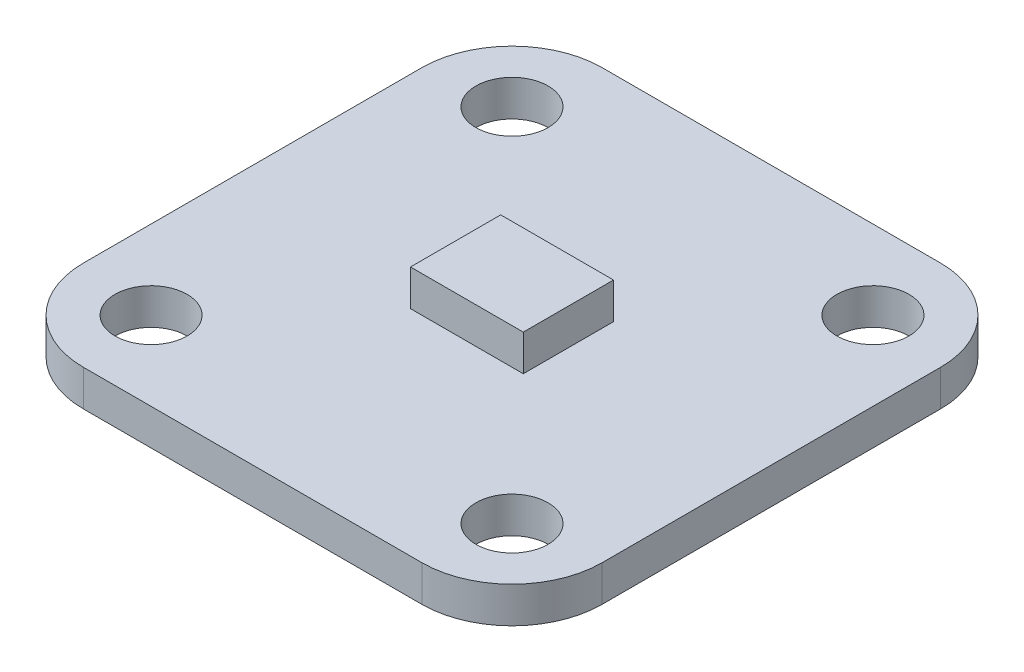
ISO-10303-21;
HEADER;
FILE_DESCRIPTION(('STEP AP214'),'2;1');
FILE_NAME('part.step','',(''),(''),'','','');
FILE_SCHEMA(('AUTOMOTIVE_DESIGN { 1 0 10303 214 1 1 1 1 }'));
ENDSEC;
DATA;
#1=APPLICATION_CONTEXT('core data for automotive mechanical design processes');
#2=APPLICATION_PROTOCOL_DEFINITION('international standard','automotive_design',2000,#1);
#3=PRODUCT_CONTEXT('',#1,'mechanical');
#4=PRODUCT('Part','Part','',(#3));
#5=PRODUCT_RELATED_PRODUCT_CATEGORY('part','',(#4));
#6=PRODUCT_DEFINITION_FORMATION('','',#4);
#7=PRODUCT_DEFINITION_CONTEXT('part definition',#1,'design');
#8=PRODUCT_DEFINITION('design','',#6,#7);
#9=PRODUCT_DEFINITION_SHAPE('','',#8);
#10=(LENGTH_UNIT() NAMED_UNIT(*) SI_UNIT(.MILLI.,.METRE.));
#11=(NAMED_UNIT(*) PLANE_ANGLE_UNIT() SI_UNIT($,.RADIAN.));
#12=(NAMED_UNIT(*) SI_UNIT($,.STERADIAN.) SOLID_ANGLE_UNIT());
#13=UNCERTAINTY_MEASURE_WITH_UNIT(LENGTH_MEASURE(1.E-05),#10,'distance_accuracy_value','');
#14=(GEOMETRIC_REPRESENTATION_CONTEXT(3) GLOBAL_UNCERTAINTY_ASSIGNED_CONTEXT((#13)) GLOBAL_UNIT_ASSIGNED_CONTEXT((#10,
#11,#12)) REPRESENTATION_CONTEXT('',''));
#15=CARTESIAN_POINT('',(0.,0.,0.));
#16=DIRECTION('',(0.,0.,1.));
#17=DIRECTION('',(1.,0.,0.));
#18=AXIS2_PLACEMENT_3D('',#15,#16,#17);
#19=CARTESIAN_POINT('',(0.,1.6,0.));
#20=DIRECTION('',(0.,-1.,0.));
#21=DIRECTION('',(0.,0.,-1.));
#22=AXIS2_PLACEMENT_3D('',#19,#20,#21);
#23=PLANE('',#22);
#24=CARTESIAN_POINT('',(-8.,1.6,-8.));
#25=DIRECTION('',(0.,-1.,0.));
#26=DIRECTION('',(0.,0.,-1.));
#27=AXIS2_PLACEMENT_3D('',#24,#25,#26);
#28=CIRCLE('',#27,1.60000000000011);
#29=CARTESIAN_POINT('',(-8.,1.6,-9.60000000000011));
#30=VERTEX_POINT('',#29);
#31=EDGE_CURVE('E477',#30,#30,#28,.F.);
#32=ORIENTED_EDGE('',*,*,#31,.F.);
#33=EDGE_LOOP('',(#32));
#34=FACE_BOUND('',#33,.T.);
#35=CARTESIAN_POINT('',(8.,1.6,-8.));
#36=DIRECTION('',(0.,-1.,0.));
#37=DIRECTION('',(0.,0.,-1.));
#38=AXIS2_PLACEMENT_3D('',#35,#36,#37);
#39=CIRCLE('',#38,1.60000000000007);
#40=CARTESIAN_POINT('',(8.,1.6,-9.60000000000007));
#41=VERTEX_POINT('',#40);
#42=EDGE_CURVE('E476',#41,#41,#39,.F.);
#43=ORIENTED_EDGE('',*,*,#42,.F.);
#44=EDGE_LOOP('',(#43));
#45=FACE_BOUND('',#44,.T.);
#46=CARTESIAN_POINT('',(8.,1.6,8.));
#47=DIRECTION('',(0.,-1.,0.));
#48=DIRECTION('',(0.,0.,-1.));
#49=AXIS2_PLACEMENT_3D('',#46,#47,#48);
#50=CIRCLE('',#49,1.60000000000004);
#51=CARTESIAN_POINT('',(8.,1.6,6.39999999999996));
#52=VERTEX_POINT('',#51);
#53=EDGE_CURVE('E483',#52,#52,#50,.F.);
#54=ORIENTED_EDGE('',*,*,#53,.F.);
#55=EDGE_LOOP('',(#54));
#56=FACE_BOUND('',#55,.T.);
#57=CARTESIAN_POINT('',(-8.,1.6,8.));
#58=DIRECTION('',(0.,-1.,0.));
#59=DIRECTION('',(0.,0.,-1.));
#60=AXIS2_PLACEMENT_3D('',#57,#58,#59);
#61=CIRCLE('',#60,1.6);
#62=CARTESIAN_POINT('',(-8.,1.6,6.4));
#63=VERTEX_POINT('',#62);
#64=EDGE_CURVE('E464',#63,#63,#61,.F.);
#65=ORIENTED_EDGE('',*,*,#64,.F.);
#66=EDGE_LOOP('',(#65));
#67=FACE_BOUND('',#66,.T.);
#68=DIRECTION('',(0.,0.,-1.));
#69=VECTOR('',#68,1.);
#70=CARTESIAN_POINT('',(11.5,1.6,11.5));
#71=LINE('',#70,#69);
#72=CARTESIAN_POINT('',(11.5,1.6,7.5));
#73=VERTEX_POINT('',#72);
#74=CARTESIAN_POINT('',(11.5,1.6,-7.5));
#75=VERTEX_POINT('',#74);
#76=EDGE_CURVE('E166',#73,#75,#71,.T.);
#77=ORIENTED_EDGE('',*,*,#76,.T.);
#78=CARTESIAN_POINT('',(7.5,1.6,-7.5));
#79=DIRECTION('',(0.,-1.,0.));
#80=DIRECTION('',(0.,0.,-1.));
#81=AXIS2_PLACEMENT_3D('',#78,#79,#80);
#82=CIRCLE('',#81,4.);
#83=CARTESIAN_POINT('',(7.5,1.6,-11.5));
#84=VERTEX_POINT('',#83);
#85=EDGE_CURVE('E206',#75,#84,#82,.F.);
#86=ORIENTED_EDGE('',*,*,#85,.T.);
#87=DIRECTION('',(-1.,0.,0.));
#88=VECTOR('',#87,1.);
#89=CARTESIAN_POINT('',(-11.5,1.6,-11.5));
#90=LINE('',#89,#88);
#91=CARTESIAN_POINT('',(-7.5,1.6,-11.5));
#92=VERTEX_POINT('',#91);
#93=EDGE_CURVE('E169',#84,#92,#90,.T.);
#94=ORIENTED_EDGE('',*,*,#93,.T.);
#95=CARTESIAN_POINT('',(-7.5,1.6,-7.5));
#96=DIRECTION('',(0.,-1.,0.));
#97=DIRECTION('',(0.,0.,-1.));
#98=AXIS2_PLACEMENT_3D('',#95,#96,#97);
#99=CIRCLE('',#98,4.);
#100=CARTESIAN_POINT('',(-11.5,1.6,-7.5));
#101=VERTEX_POINT('',#100);
#102=EDGE_CURVE('E204',#92,#101,#99,.F.);
#103=ORIENTED_EDGE('',*,*,#102,.T.);
#104=DIRECTION('',(0.,0.,1.));
#105=VECTOR('',#104,1.);
#106=CARTESIAN_POINT('',(-11.5,1.6,11.5));
#107=LINE('',#106,#105);
#108=CARTESIAN_POINT('',(-11.5,1.6,7.5));
#109=VERTEX_POINT('',#108);
#110=EDGE_CURVE('E173',#101,#109,#107,.T.);
#111=ORIENTED_EDGE('',*,*,#110,.T.);
#112=CARTESIAN_POINT('',(-7.5,1.6,7.5));
#113=DIRECTION('',(0.,-1.,0.));
#114=DIRECTION('',(0.,0.,-1.));
#115=AXIS2_PLACEMENT_3D('',#112,#113,#114);
#116=CIRCLE('',#115,4.);
#117=CARTESIAN_POINT('',(-7.5,1.6,11.5));
#118=VERTEX_POINT('',#117);
#119=EDGE_CURVE('E63',#109,#118,#116,.F.);
#120=ORIENTED_EDGE('',*,*,#119,.T.);
#121=DIRECTION('',(1.,0.,0.));
#122=VECTOR('',#121,1.);
#123=CARTESIAN_POINT('',(-11.5,1.6,11.5));
#124=LINE('',#123,#122);
#125=CARTESIAN_POINT('',(7.5,1.6,11.5));
#126=VERTEX_POINT('',#125);
#127=EDGE_CURVE('E175',#118,#126,#124,.T.);
#128=ORIENTED_EDGE('',*,*,#127,.T.);
#129=CARTESIAN_POINT('',(7.5,1.6,7.5));
#130=DIRECTION('',(0.,-1.,0.));
#131=DIRECTION('',(0.,0.,-1.));
#132=AXIS2_PLACEMENT_3D('',#129,#130,#131);
#133=CIRCLE('',#132,4.);
#134=EDGE_CURVE('E202',#126,#73,#133,.F.);
#135=ORIENTED_EDGE('',*,*,#134,.T.);
#136=EDGE_LOOP('',(#77,#86,#94,#103,#111,#120,#128,#135));
#137=FACE_BOUND('',#136,.T.);
#138=DIRECTION('',(0.,0.,-1.));
#139=VECTOR('',#138,1.);
#140=CARTESIAN_POINT('',(2.5,1.6,2.));
#141=LINE('',#140,#139);
#142=CARTESIAN_POINT('',(2.5,1.6,2.));
#143=VERTEX_POINT('',#142);
#144=CARTESIAN_POINT('',(2.5,1.6,-2.));
#145=VERTEX_POINT('',#144);
#146=EDGE_CURVE('E156',#143,#145,#141,.T.);
#147=ORIENTED_EDGE('',*,*,#146,.F.);
#148=DIRECTION('',(1.,0.,0.));
#149=VECTOR('',#148,1.);
#150=CARTESIAN_POINT('',(-2.5,1.6,2.));
#151=LINE('',#150,#149);
#152=CARTESIAN_POINT('',(-2.5,1.6,2.));
#153=VERTEX_POINT('',#152);
#154=EDGE_CURVE('E153',#153,#143,#151,.T.);
#155=ORIENTED_EDGE('',*,*,#154,.F.);
#156=DIRECTION('',(0.,0.,1.));
#157=VECTOR('',#156,1.);
#158=CARTESIAN_POINT('',(-2.5,1.6,2.));
#159=LINE('',#158,#157);
#160=CARTESIAN_POINT('',(-2.5,1.6,-2.));
#161=VERTEX_POINT('',#160);
#162=EDGE_CURVE('E453',#161,#153,#159,.T.);
#163=ORIENTED_EDGE('',*,*,#162,.F.);
#164=DIRECTION('',(-1.,0.,0.));
#165=VECTOR('',#164,1.);
#166=CARTESIAN_POINT('',(-2.5,1.6,-2.));
#167=LINE('',#166,#165);
#168=EDGE_CURVE('E455',#145,#161,#167,.T.);
#169=ORIENTED_EDGE('',*,*,#168,.F.);
#170=EDGE_LOOP('',(#147,#155,#163,#169));
#171=FACE_BOUND('',#170,.T.);
#172=ADVANCED_FACE('F43',(#34,#45,#56,#67,#137,#171),#23,.F.);
#173=CARTESIAN_POINT('',(11.5,1.6,11.5));
#174=DIRECTION('',(-1.,0.,0.));
#175=DIRECTION('',(0.,0.,1.));
#176=AXIS2_PLACEMENT_3D('',#173,#174,#175);
#177=PLANE('',#176);
#178=DIRECTION('',(0.,0.,-1.));
#179=VECTOR('',#178,1.);
#180=CARTESIAN_POINT('',(11.5,0.,11.5));
#181=LINE('',#180,#179);
#182=CARTESIAN_POINT('',(11.5,0.,7.5));
#183=VERTEX_POINT('',#182);
#184=CARTESIAN_POINT('',(11.5,0.,-7.5));
#185=VERTEX_POINT('',#184);
#186=EDGE_CURVE('E157',#183,#185,#181,.T.);
#187=ORIENTED_EDGE('',*,*,#186,.T.);
#188=DIRECTION('',(0.,-1.,0.));
#189=VECTOR('',#188,1.);
#190=CARTESIAN_POINT('',(11.5,1.6,-7.5));
#191=LINE('',#190,#189);
#192=EDGE_CURVE('E199',#185,#75,#191,.F.);
#193=ORIENTED_EDGE('',*,*,#192,.T.);
#194=ORIENTED_EDGE('',*,*,#76,.F.);
#195=DIRECTION('',(0.,-1.,0.));
#196=VECTOR('',#195,1.);
#197=CARTESIAN_POINT('',(11.5,1.6,7.5));
#198=LINE('',#197,#196);
#199=EDGE_CURVE('E196',#73,#183,#198,.T.);
#200=ORIENTED_EDGE('',*,*,#199,.T.);
#201=EDGE_LOOP('',(#187,#193,#194,#200));
#202=FACE_BOUND('',#201,.T.);
#203=ADVANCED_FACE('F228',(#202),#177,.F.);
#204=CARTESIAN_POINT('',(-11.5,1.6,-11.5));
#205=DIRECTION('',(0.,0.,1.));
#206=DIRECTION('',(1.,0.,0.));
#207=AXIS2_PLACEMENT_3D('',#204,#205,#206);
#208=PLANE('',#207);
#209=ORIENTED_EDGE('',*,*,#93,.F.);
#210=DIRECTION('',(0.,-1.,0.));
#211=VECTOR('',#210,1.);
#212=CARTESIAN_POINT('',(7.5,1.6,-11.5));
#213=LINE('',#212,#211);
#214=CARTESIAN_POINT('',(7.5,0.,-11.5));
#215=VERTEX_POINT('',#214);
#216=EDGE_CURVE('E185',#84,#215,#213,.T.);
#217=ORIENTED_EDGE('',*,*,#216,.T.);
#218=DIRECTION('',(-1.,0.,0.));
#219=VECTOR('',#218,1.);
#220=CARTESIAN_POINT('',(-11.5,0.,-11.5));
#221=LINE('',#220,#219);
#222=CARTESIAN_POINT('',(-7.5,0.,-11.5));
#223=VERTEX_POINT('',#222);
#224=EDGE_CURVE('E160',#215,#223,#221,.T.);
#225=ORIENTED_EDGE('',*,*,#224,.T.);
#226=DIRECTION('',(0.,-1.,0.));
#227=VECTOR('',#226,1.);
#228=CARTESIAN_POINT('',(-7.5,1.6,-11.5));
#229=LINE('',#228,#227);
#230=EDGE_CURVE('E176',#223,#92,#229,.F.);
#231=ORIENTED_EDGE('',*,*,#230,.T.);
#232=EDGE_LOOP('',(#209,#217,#225,#231));
#233=FACE_BOUND('',#232,.T.);
#234=ADVANCED_FACE('F237',(#233),#208,.F.);
#235=CARTESIAN_POINT('',(-11.5,1.6,11.5));
#236=DIRECTION('',(1.,0.,0.));
#237=DIRECTION('',(0.,0.,-1.));
#238=AXIS2_PLACEMENT_3D('',#235,#236,#237);
#239=PLANE('',#238);
#240=ORIENTED_EDGE('',*,*,#110,.F.);
#241=DIRECTION('',(0.,-1.,0.));
#242=VECTOR('',#241,1.);
#243=CARTESIAN_POINT('',(-11.5,1.6,-7.5));
#244=LINE('',#243,#242);
#245=CARTESIAN_POINT('',(-11.5,0.,-7.5));
#246=VERTEX_POINT('',#245);
#247=EDGE_CURVE('E210',#101,#246,#244,.T.);
#248=ORIENTED_EDGE('',*,*,#247,.T.);
#249=DIRECTION('',(0.,0.,1.));
#250=VECTOR('',#249,1.);
#251=CARTESIAN_POINT('',(-11.5,0.,11.5));
#252=LINE('',#251,#250);
#253=CARTESIAN_POINT('',(-11.5,0.,7.5));
#254=VERTEX_POINT('',#253);
#255=EDGE_CURVE('E180',#246,#254,#252,.T.);
#256=ORIENTED_EDGE('',*,*,#255,.T.);
#257=DIRECTION('',(0.,-1.,0.));
#258=VECTOR('',#257,1.);
#259=CARTESIAN_POINT('',(-11.5,1.6,7.5));
#260=LINE('',#259,#258);
#261=EDGE_CURVE('E208',#254,#109,#260,.F.);
#262=ORIENTED_EDGE('',*,*,#261,.T.);
#263=EDGE_LOOP('',(#240,#248,#256,#262));
#264=FACE_BOUND('',#263,.T.);
#265=ADVANCED_FACE('F245',(#264),#239,.F.);
#266=CARTESIAN_POINT('',(-11.5,1.6,11.5));
#267=DIRECTION('',(0.,0.,-1.));
#268=DIRECTION('',(-1.,0.,0.));
#269=AXIS2_PLACEMENT_3D('',#266,#267,#268);
#270=PLANE('',#269);
#271=DIRECTION('',(1.,0.,0.));
#272=VECTOR('',#271,1.);
#273=CARTESIAN_POINT('',(-11.5,0.,11.5));
#274=LINE('',#273,#272);
#275=CARTESIAN_POINT('',(-7.5,0.,11.5));
#276=VERTEX_POINT('',#275);
#277=CARTESIAN_POINT('',(7.5,0.,11.5));
#278=VERTEX_POINT('',#277);
#279=EDGE_CURVE('E170',#276,#278,#274,.T.);
#280=ORIENTED_EDGE('',*,*,#279,.T.);
#281=DIRECTION('',(0.,-1.,0.));
#282=VECTOR('',#281,1.);
#283=CARTESIAN_POINT('',(7.5,1.6,11.5));
#284=LINE('',#283,#282);
#285=EDGE_CURVE('E11',#278,#126,#284,.F.);
#286=ORIENTED_EDGE('',*,*,#285,.T.);
#287=ORIENTED_EDGE('',*,*,#127,.F.);
#288=DIRECTION('',(0.,-1.,0.));
#289=VECTOR('',#288,1.);
#290=CARTESIAN_POINT('',(-7.5,1.6,11.5));
#291=LINE('',#290,#289);
#292=EDGE_CURVE('E51',#118,#276,#291,.T.);
#293=ORIENTED_EDGE('',*,*,#292,.T.);
#294=EDGE_LOOP('',(#280,#286,#287,#293));
#295=FACE_BOUND('',#294,.T.);
#296=ADVANCED_FACE('F215',(#295),#270,.F.);
#297=CARTESIAN_POINT('',(0.,0.,0.));
#298=DIRECTION('',(0.,-1.,0.));
#299=DIRECTION('',(0.,0.,-1.));
#300=AXIS2_PLACEMENT_3D('',#297,#298,#299);
#301=PLANE('',#300);
#302=CARTESIAN_POINT('',(-8.,0.,-8.));
#303=DIRECTION('',(0.,-1.,0.));
#304=DIRECTION('',(0.,0.,-1.));
#305=AXIS2_PLACEMENT_3D('',#302,#303,#304);
#306=CIRCLE('',#305,1.60000000000011);
#307=CARTESIAN_POINT('',(-8.,0.,-9.60000000000011));
#308=VERTEX_POINT('',#307);
#309=EDGE_CURVE('E473',#308,#308,#306,.T.);
#310=ORIENTED_EDGE('',*,*,#309,.F.);
#311=EDGE_LOOP('',(#310));
#312=FACE_BOUND('',#311,.T.);
#313=CARTESIAN_POINT('',(8.,0.,-8.));
#314=DIRECTION('',(0.,-1.,0.));
#315=DIRECTION('',(0.,0.,-1.));
#316=AXIS2_PLACEMENT_3D('',#313,#314,#315);
#317=CIRCLE('',#316,1.60000000000007);
#318=CARTESIAN_POINT('',(8.,0.,-9.60000000000007));
#319=VERTEX_POINT('',#318);
#320=EDGE_CURVE('E480',#319,#319,#317,.T.);
#321=ORIENTED_EDGE('',*,*,#320,.F.);
#322=EDGE_LOOP('',(#321));
#323=FACE_BOUND('',#322,.T.);
#324=CARTESIAN_POINT('',(8.,0.,8.));
#325=DIRECTION('',(0.,-1.,0.));
#326=DIRECTION('',(0.,0.,-1.));
#327=AXIS2_PLACEMENT_3D('',#324,#325,#326);
#328=CIRCLE('',#327,1.60000000000004);
#329=CARTESIAN_POINT('',(8.,0.,6.39999999999996));
#330=VERTEX_POINT('',#329);
#331=EDGE_CURVE('E472',#330,#330,#328,.T.);
#332=ORIENTED_EDGE('',*,*,#331,.F.);
#333=EDGE_LOOP('',(#332));
#334=FACE_BOUND('',#333,.T.);
#335=CARTESIAN_POINT('',(-8.,0.,8.));
#336=DIRECTION('',(0.,-1.,0.));
#337=DIRECTION('',(0.,0.,-1.));
#338=AXIS2_PLACEMENT_3D('',#335,#336,#337);
#339=CIRCLE('',#338,1.6);
#340=CARTESIAN_POINT('',(-8.,0.,6.4));
#341=VERTEX_POINT('',#340);
#342=EDGE_CURVE('E469',#341,#341,#339,.T.);
#343=ORIENTED_EDGE('',*,*,#342,.F.);
#344=EDGE_LOOP('',(#343));
#345=FACE_BOUND('',#344,.T.);
#346=ORIENTED_EDGE('',*,*,#224,.F.);
#347=CARTESIAN_POINT('',(7.5,0.,-7.5));
#348=DIRECTION('',(0.,-1.,0.));
#349=DIRECTION('',(0.,0.,-1.));
#350=AXIS2_PLACEMENT_3D('',#347,#348,#349);
#351=CIRCLE('',#350,4.);
#352=EDGE_CURVE('E194',#215,#185,#351,.T.);
#353=ORIENTED_EDGE('',*,*,#352,.T.);
#354=ORIENTED_EDGE('',*,*,#186,.F.);
#355=CARTESIAN_POINT('',(7.5,0.,7.5));
#356=DIRECTION('',(0.,-1.,0.));
#357=DIRECTION('',(0.,0.,-1.));
#358=AXIS2_PLACEMENT_3D('',#355,#356,#357);
#359=CIRCLE('',#358,4.);
#360=EDGE_CURVE('E190',#183,#278,#359,.T.);
#361=ORIENTED_EDGE('',*,*,#360,.T.);
#362=ORIENTED_EDGE('',*,*,#279,.F.);
#363=CARTESIAN_POINT('',(-7.5,0.,7.5));
#364=DIRECTION('',(0.,-1.,0.));
#365=DIRECTION('',(0.,0.,-1.));
#366=AXIS2_PLACEMENT_3D('',#363,#364,#365);
#367=CIRCLE('',#366,4.);
#368=EDGE_CURVE('E188',#276,#254,#367,.T.);
#369=ORIENTED_EDGE('',*,*,#368,.T.);
#370=ORIENTED_EDGE('',*,*,#255,.F.);
#371=CARTESIAN_POINT('',(-7.5,0.,-7.5));
#372=DIRECTION('',(0.,-1.,0.));
#373=DIRECTION('',(0.,0.,-1.));
#374=AXIS2_PLACEMENT_3D('',#371,#372,#373);
#375=CIRCLE('',#374,4.);
#376=EDGE_CURVE('E192',#246,#223,#375,.T.);
#377=ORIENTED_EDGE('',*,*,#376,.T.);
#378=EDGE_LOOP('',(#346,#353,#354,#361,#362,#369,#370,#377));
#379=FACE_BOUND('',#378,.T.);
#380=ADVANCED_FACE('F219',(#312,#323,#334,#345,#379),#301,.T.);
#381=CARTESIAN_POINT('',(2.5,3.2,2.));
#382=DIRECTION('',(-1.,0.,0.));
#383=DIRECTION('',(0.,0.,1.));
#384=AXIS2_PLACEMENT_3D('',#381,#382,#383);
#385=PLANE('',#384);
#386=ORIENTED_EDGE('',*,*,#146,.T.);
#387=DIRECTION('',(0.,-1.,0.));
#388=VECTOR('',#387,1.);
#389=CARTESIAN_POINT('',(2.5,3.2,-2.));
#390=LINE('',#389,#388);
#391=CARTESIAN_POINT('',(2.5,3.2,-2.));
#392=VERTEX_POINT('',#391);
#393=EDGE_CURVE('E137',#392,#145,#390,.T.);
#394=ORIENTED_EDGE('',*,*,#393,.F.);
#395=DIRECTION('',(0.,0.,-1.));
#396=VECTOR('',#395,1.);
#397=CARTESIAN_POINT('',(2.5,3.2,2.));
#398=LINE('',#397,#396);
#399=CARTESIAN_POINT('',(2.5,3.2,2.));
#400=VERTEX_POINT('',#399);
#401=EDGE_CURVE('E144',#400,#392,#398,.T.);
#402=ORIENTED_EDGE('',*,*,#401,.F.);
#403=DIRECTION('',(0.,-1.,0.));
#404=VECTOR('',#403,1.);
#405=CARTESIAN_POINT('',(2.5,3.2,2.));
#406=LINE('',#405,#404);
#407=EDGE_CURVE('E458',#400,#143,#406,.T.);
#408=ORIENTED_EDGE('',*,*,#407,.T.);
#409=EDGE_LOOP('',(#386,#394,#402,#408));
#410=FACE_BOUND('',#409,.T.);
#411=ADVANCED_FACE('F155',(#410),#385,.F.);
#412=CARTESIAN_POINT('',(-2.5,3.2,-2.));
#413=DIRECTION('',(0.,0.,1.));
#414=DIRECTION('',(1.,0.,0.));
#415=AXIS2_PLACEMENT_3D('',#412,#413,#414);
#416=PLANE('',#415);
#417=ORIENTED_EDGE('',*,*,#168,.T.);
#418=DIRECTION('',(0.,-1.,0.));
#419=VECTOR('',#418,1.);
#420=CARTESIAN_POINT('',(-2.5,3.2,-2.));
#421=LINE('',#420,#419);
#422=CARTESIAN_POINT('',(-2.5,3.2,-2.));
#423=VERTEX_POINT('',#422);
#424=EDGE_CURVE('E140',#423,#161,#421,.T.);
#425=ORIENTED_EDGE('',*,*,#424,.F.);
#426=DIRECTION('',(-1.,0.,0.));
#427=VECTOR('',#426,1.);
#428=CARTESIAN_POINT('',(-2.5,3.2,-2.));
#429=LINE('',#428,#427);
#430=EDGE_CURVE('E132',#392,#423,#429,.T.);
#431=ORIENTED_EDGE('',*,*,#430,.F.);
#432=ORIENTED_EDGE('',*,*,#393,.T.);
#433=EDGE_LOOP('',(#417,#425,#431,#432));
#434=FACE_BOUND('',#433,.T.);
#435=ADVANCED_FACE('F135',(#434),#416,.F.);
#436=CARTESIAN_POINT('',(-2.5,3.2,2.));
#437=DIRECTION('',(1.,0.,0.));
#438=DIRECTION('',(0.,0.,-1.));
#439=AXIS2_PLACEMENT_3D('',#436,#437,#438);
#440=PLANE('',#439);
#441=ORIENTED_EDGE('',*,*,#162,.T.);
#442=DIRECTION('',(0.,-1.,0.));
#443=VECTOR('',#442,1.);
#444=CARTESIAN_POINT('',(-2.5,3.2,2.));
#445=LINE('',#444,#443);
#446=CARTESIAN_POINT('',(-2.5,3.2,2.));
#447=VERTEX_POINT('',#446);
#448=EDGE_CURVE('E162',#447,#153,#445,.T.);
#449=ORIENTED_EDGE('',*,*,#448,.F.);
#450=DIRECTION('',(0.,0.,1.));
#451=VECTOR('',#450,1.);
#452=CARTESIAN_POINT('',(-2.5,3.2,2.));
#453=LINE('',#452,#451);
#454=EDGE_CURVE('E143',#423,#447,#453,.T.);
#455=ORIENTED_EDGE('',*,*,#454,.F.);
#456=ORIENTED_EDGE('',*,*,#424,.T.);
#457=EDGE_LOOP('',(#441,#449,#455,#456));
#458=FACE_BOUND('',#457,.T.);
#459=ADVANCED_FACE('F380',(#458),#440,.F.);
#460=CARTESIAN_POINT('',(-2.5,3.2,2.));
#461=DIRECTION('',(0.,0.,-1.));
#462=DIRECTION('',(-1.,0.,0.));
#463=AXIS2_PLACEMENT_3D('',#460,#461,#462);
#464=PLANE('',#463);
#465=ORIENTED_EDGE('',*,*,#154,.T.);
#466=ORIENTED_EDGE('',*,*,#407,.F.);
#467=DIRECTION('',(1.,0.,0.));
#468=VECTOR('',#467,1.);
#469=CARTESIAN_POINT('',(-2.5,3.2,2.));
#470=LINE('',#469,#468);
#471=EDGE_CURVE('E149',#447,#400,#470,.T.);
#472=ORIENTED_EDGE('',*,*,#471,.F.);
#473=ORIENTED_EDGE('',*,*,#448,.T.);
#474=EDGE_LOOP('',(#465,#466,#472,#473));
#475=FACE_BOUND('',#474,.T.);
#476=ADVANCED_FACE('F371',(#475),#464,.F.);
#477=CARTESIAN_POINT('',(0.,3.2,0.));
#478=DIRECTION('',(0.,-1.,0.));
#479=DIRECTION('',(0.,0.,-1.));
#480=AXIS2_PLACEMENT_3D('',#477,#478,#479);
#481=PLANE('',#480);
#482=ORIENTED_EDGE('',*,*,#401,.T.);
#483=ORIENTED_EDGE('',*,*,#430,.T.);
#484=ORIENTED_EDGE('',*,*,#454,.T.);
#485=ORIENTED_EDGE('',*,*,#471,.T.);
#486=EDGE_LOOP('',(#482,#483,#484,#485));
#487=FACE_BOUND('',#486,.T.);
#488=ADVANCED_FACE('F147',(#487),#481,.F.);
#489=CARTESIAN_POINT('',(7.5,1.6,-7.5));
#490=DIRECTION('',(0.,-1.,0.));
#491=DIRECTION('',(0.,0.,-1.));
#492=AXIS2_PLACEMENT_3D('',#489,#490,#491);
#493=CYLINDRICAL_SURFACE('',#492,4.);
#494=ORIENTED_EDGE('',*,*,#85,.F.);
#495=ORIENTED_EDGE('',*,*,#192,.F.);
#496=ORIENTED_EDGE('',*,*,#352,.F.);
#497=ORIENTED_EDGE('',*,*,#216,.F.);
#498=EDGE_LOOP('',(#494,#495,#496,#497));
#499=FACE_BOUND('',#498,.T.);
#500=ADVANCED_FACE('F235',(#499),#493,.T.);
#501=CARTESIAN_POINT('',(-7.5,1.6,-7.5));
#502=DIRECTION('',(0.,-1.,0.));
#503=DIRECTION('',(0.,0.,-1.));
#504=AXIS2_PLACEMENT_3D('',#501,#502,#503);
#505=CYLINDRICAL_SURFACE('',#504,4.);
#506=ORIENTED_EDGE('',*,*,#102,.F.);
#507=ORIENTED_EDGE('',*,*,#230,.F.);
#508=ORIENTED_EDGE('',*,*,#376,.F.);
#509=ORIENTED_EDGE('',*,*,#247,.F.);
#510=EDGE_LOOP('',(#506,#507,#508,#509));
#511=FACE_BOUND('',#510,.T.);
#512=ADVANCED_FACE('F242',(#511),#505,.T.);
#513=CARTESIAN_POINT('',(7.5,1.6,7.5));
#514=DIRECTION('',(0.,-1.,0.));
#515=DIRECTION('',(0.,0.,-1.));
#516=AXIS2_PLACEMENT_3D('',#513,#514,#515);
#517=CYLINDRICAL_SURFACE('',#516,4.);
#518=ORIENTED_EDGE('',*,*,#134,.F.);
#519=ORIENTED_EDGE('',*,*,#285,.F.);
#520=ORIENTED_EDGE('',*,*,#360,.F.);
#521=ORIENTED_EDGE('',*,*,#199,.F.);
#522=EDGE_LOOP('',(#518,#519,#520,#521));
#523=FACE_BOUND('',#522,.T.);
#524=ADVANCED_FACE('F225',(#523),#517,.T.);
#525=CARTESIAN_POINT('',(-7.5,1.6,7.5));
#526=DIRECTION('',(0.,-1.,0.));
#527=DIRECTION('',(0.,0.,-1.));
#528=AXIS2_PLACEMENT_3D('',#525,#526,#527);
#529=CYLINDRICAL_SURFACE('',#528,4.);
#530=ORIENTED_EDGE('',*,*,#119,.F.);
#531=ORIENTED_EDGE('',*,*,#261,.F.);
#532=ORIENTED_EDGE('',*,*,#368,.F.);
#533=ORIENTED_EDGE('',*,*,#292,.F.);
#534=EDGE_LOOP('',(#530,#531,#532,#533));
#535=FACE_BOUND('',#534,.T.);
#536=ADVANCED_FACE('F45',(#535),#529,.T.);
#537=CARTESIAN_POINT('',(-8.,3.201,8.));
#538=DIRECTION('',(0.,-1.,0.));
#539=DIRECTION('',(0.,0.,-1.));
#540=AXIS2_PLACEMENT_3D('',#537,#538,#539);
#541=CYLINDRICAL_SURFACE('',#540,1.6);
#542=ORIENTED_EDGE('',*,*,#342,.T.);
#543=EDGE_LOOP('',(#542));
#544=FACE_BOUND('',#543,.T.);
#545=ORIENTED_EDGE('',*,*,#64,.T.);
#546=EDGE_LOOP('',(#545));
#547=FACE_BOUND('',#546,.T.);
#548=ADVANCED_FACE('F248',(#544,#547),#541,.F.);
#549=CARTESIAN_POINT('',(8.,3.201,8.));
#550=DIRECTION('',(0.,-1.,0.));
#551=DIRECTION('',(0.,0.,-1.));
#552=AXIS2_PLACEMENT_3D('',#549,#550,#551);
#553=CYLINDRICAL_SURFACE('',#552,1.60000000000004);
#554=ORIENTED_EDGE('',*,*,#331,.T.);
#555=EDGE_LOOP('',(#554));
#556=FACE_BOUND('',#555,.T.);
#557=ORIENTED_EDGE('',*,*,#53,.T.);
#558=EDGE_LOOP('',(#557));
#559=FACE_BOUND('',#558,.T.);
#560=ADVANCED_FACE('F253',(#556,#559),#553,.F.);
#561=CARTESIAN_POINT('',(8.,3.201,-8.));
#562=DIRECTION('',(0.,-1.,0.));
#563=DIRECTION('',(0.,0.,-1.));
#564=AXIS2_PLACEMENT_3D('',#561,#562,#563);
#565=CYLINDRICAL_SURFACE('',#564,1.60000000000007);
#566=ORIENTED_EDGE('',*,*,#320,.T.);
#567=EDGE_LOOP('',(#566));
#568=FACE_BOUND('',#567,.T.);
#569=ORIENTED_EDGE('',*,*,#42,.T.);
#570=EDGE_LOOP('',(#569));
#571=FACE_BOUND('',#570,.T.);
#572=ADVANCED_FACE('F325',(#568,#571),#565,.F.);
#573=CARTESIAN_POINT('',(-8.,3.201,-8.));
#574=DIRECTION('',(0.,-1.,0.));
#575=DIRECTION('',(0.,0.,-1.));
#576=AXIS2_PLACEMENT_3D('',#573,#574,#575);
#577=CYLINDRICAL_SURFACE('',#576,1.60000000000011);
#578=ORIENTED_EDGE('',*,*,#309,.T.);
#579=EDGE_LOOP('',(#578));
#580=FACE_BOUND('',#579,.T.);
#581=ORIENTED_EDGE('',*,*,#31,.T.);
#582=EDGE_LOOP('',(#581));
#583=FACE_BOUND('',#582,.T.);
#584=ADVANCED_FACE('F336',(#580,#583),#577,.F.);
#585=CLOSED_SHELL('',(#172,#203,#234,#265,#296,#380,#411,#435,#459,#476,#488,#500,#512,#524,
#536,#548,#560,#572,#584));
#586=MANIFOLD_SOLID_BREP('B2',#585);
#587=ADVANCED_BREP_SHAPE_REPRESENTATION('',(#18,#586),#14);
#588=SHAPE_DEFINITION_REPRESENTATION(#9,#587);
ENDSEC;
END-ISO-10303-21;
